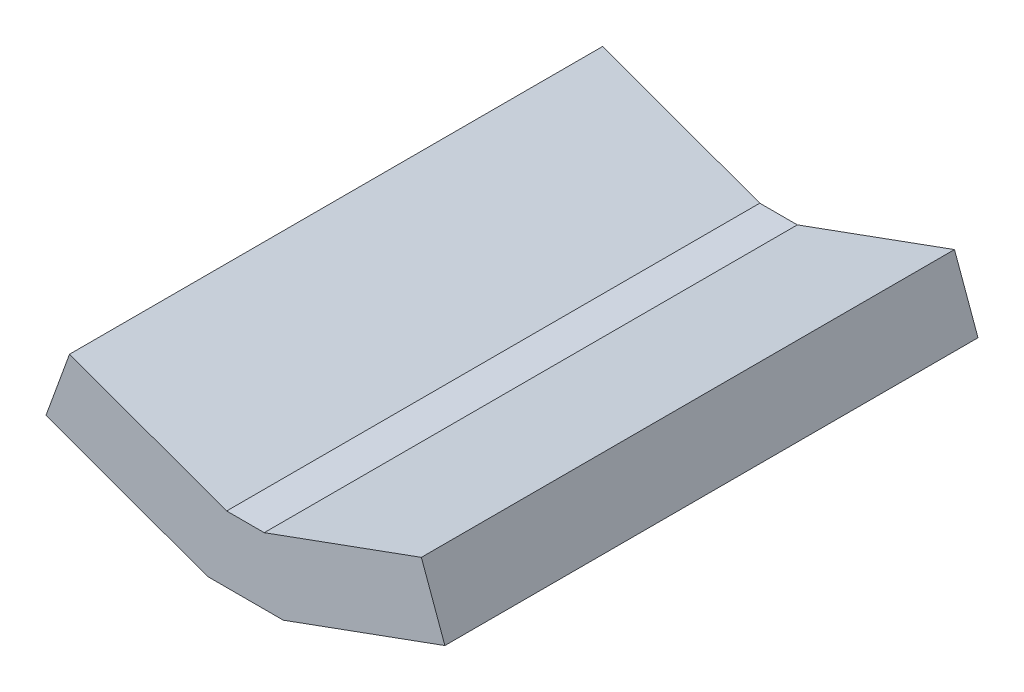
ISO-10303-21;
HEADER;
FILE_DESCRIPTION(('STEP AP214'),'2;1');
FILE_NAME('part.step','',(''),(''),'','','');
FILE_SCHEMA(('AUTOMOTIVE_DESIGN { 1 0 10303 214 1 1 1 1 }'));
ENDSEC;
DATA;
#1=APPLICATION_CONTEXT('core data for automotive mechanical design processes');
#2=APPLICATION_PROTOCOL_DEFINITION('international standard','automotive_design',2000,#1);
#3=PRODUCT_CONTEXT('',#1,'mechanical');
#4=PRODUCT('Part','Part','',(#3));
#5=PRODUCT_RELATED_PRODUCT_CATEGORY('part','',(#4));
#6=PRODUCT_DEFINITION_FORMATION('','',#4);
#7=PRODUCT_DEFINITION_CONTEXT('part definition',#1,'design');
#8=PRODUCT_DEFINITION('design','',#6,#7);
#9=PRODUCT_DEFINITION_SHAPE('','',#8);
#10=(LENGTH_UNIT() NAMED_UNIT(*) SI_UNIT(.MILLI.,.METRE.));
#11=(NAMED_UNIT(*) PLANE_ANGLE_UNIT() SI_UNIT($,.RADIAN.));
#12=(NAMED_UNIT(*) SI_UNIT($,.STERADIAN.) SOLID_ANGLE_UNIT());
#13=UNCERTAINTY_MEASURE_WITH_UNIT(LENGTH_MEASURE(1.E-05),#10,'distance_accuracy_value','');
#14=(GEOMETRIC_REPRESENTATION_CONTEXT(3) GLOBAL_UNCERTAINTY_ASSIGNED_CONTEXT((#13)) GLOBAL_UNIT_ASSIGNED_CONTEXT((#10,
#11,#12)) REPRESENTATION_CONTEXT('',''));
#15=CARTESIAN_POINT('',(0.,0.,0.));
#16=DIRECTION('',(0.,0.,1.));
#17=DIRECTION('',(1.,0.,0.));
#18=AXIS2_PLACEMENT_3D('',#15,#16,#17);
#19=CARTESIAN_POINT('',(11.,0.,77.4999999977638));
#20=DIRECTION('',(-0.34202014332567,0.939692620785908,0.));
#21=DIRECTION('',(-0.939692620785908,-0.34202014332567,0.));
#22=AXIS2_PLACEMENT_3D('',#19,#20,#21);
#23=PLANE('',#22);
#24=DIRECTION('',(0.,0.,-1.));
#25=VECTOR('',#24,1.);
#26=CARTESIAN_POINT('',(11.,0.,77.4999999977638));
#27=LINE('',#26,#25);
#28=CARTESIAN_POINT('',(11.,0.,77.4999999977638));
#29=VERTEX_POINT('',#28);
#30=CARTESIAN_POINT('',(11.,0.,-77.5));
#31=VERTEX_POINT('',#30);
#32=EDGE_CURVE('E117',#29,#31,#27,.T.);
#33=ORIENTED_EDGE('',*,*,#32,.T.);
#34=DIRECTION('',(0.939692620785908,0.34202014332567,0.));
#35=VECTOR('',#34,1.);
#36=CARTESIAN_POINT('',(11.,0.,-77.5));
#37=LINE('',#36,#35);
#38=CARTESIAN_POINT('',(57.9846310392954,17.1010071662835,-77.5));
#39=VERTEX_POINT('',#38);
#40=EDGE_CURVE('E111',#31,#39,#37,.T.);
#41=ORIENTED_EDGE('',*,*,#40,.T.);
#42=DIRECTION('',(0.,0.,-1.));
#43=VECTOR('',#42,1.);
#44=CARTESIAN_POINT('',(57.9846310392954,17.1010071662835,77.4999999977638));
#45=LINE('',#44,#43);
#46=CARTESIAN_POINT('',(57.9846310392954,17.1010071662835,77.4999999977638));
#47=VERTEX_POINT('',#46);
#48=EDGE_CURVE('E11',#47,#39,#45,.T.);
#49=ORIENTED_EDGE('',*,*,#48,.F.);
#50=DIRECTION('',(0.939692620785908,0.34202014332567,0.));
#51=VECTOR('',#50,1.);
#52=CARTESIAN_POINT('',(11.,0.,77.4999999977638));
#53=LINE('',#52,#51);
#54=EDGE_CURVE('E135',#29,#47,#53,.T.);
#55=ORIENTED_EDGE('',*,*,#54,.F.);
#56=EDGE_LOOP('',(#33,#41,#49,#55));
#57=FACE_BOUND('',#56,.T.);
#58=ADVANCED_FACE('F35',(#57),#23,.F.);
#59=CARTESIAN_POINT('',(57.9846310392954,17.1010071662835,77.4999999977638));
#60=DIRECTION('',(-0.939692620785908,-0.34202014332567,0.));
#61=DIRECTION('',(0.34202014332567,-0.939692620785908,0.));
#62=AXIS2_PLACEMENT_3D('',#59,#60,#61);
#63=PLANE('',#62);
#64=ORIENTED_EDGE('',*,*,#48,.T.);
#65=DIRECTION('',(-0.34202014332567,0.939692620785908,0.));
#66=VECTOR('',#65,1.);
#67=CARTESIAN_POINT('',(57.9846310392954,17.1010071662835,-77.5));
#68=LINE('',#67,#66);
#69=CARTESIAN_POINT('',(51.144228172782,35.8948595820016,-77.5));
#70=VERTEX_POINT('',#69);
#71=EDGE_CURVE('E101',#39,#70,#68,.T.);
#72=ORIENTED_EDGE('',*,*,#71,.T.);
#73=DIRECTION('',(0.,0.,-1.));
#74=VECTOR('',#73,1.);
#75=CARTESIAN_POINT('',(51.144228172782,35.8948595820016,77.4999999977638));
#76=LINE('',#75,#74);
#77=CARTESIAN_POINT('',(51.144228172782,35.8948595820016,77.4999999977638));
#78=VERTEX_POINT('',#77);
#79=EDGE_CURVE('E42',#78,#70,#76,.T.);
#80=ORIENTED_EDGE('',*,*,#79,.F.);
#81=DIRECTION('',(-0.34202014332567,0.939692620785908,0.));
#82=VECTOR('',#81,1.);
#83=CARTESIAN_POINT('',(57.9846310392954,17.1010071662835,77.4999999977638));
#84=LINE('',#83,#82);
#85=EDGE_CURVE('E102',#47,#78,#84,.T.);
#86=ORIENTED_EDGE('',*,*,#85,.F.);
#87=EDGE_LOOP('',(#64,#72,#80,#86));
#88=FACE_BOUND('',#87,.T.);
#89=ADVANCED_FACE('F99',(#88),#63,.F.);
#90=CARTESIAN_POINT('',(51.144228172782,35.8948595820016,77.4999999977638));
#91=DIRECTION('',(0.34202014332567,-0.939692620785908,0.));
#92=DIRECTION('',(0.939692620785908,0.34202014332567,0.));
#93=AXIS2_PLACEMENT_3D('',#90,#91,#92);
#94=PLANE('',#93);
#95=ORIENTED_EDGE('',*,*,#79,.T.);
#96=DIRECTION('',(-0.939692620785908,-0.34202014332567,0.));
#97=VECTOR('',#96,1.);
#98=CARTESIAN_POINT('',(51.144228172782,35.8948595820016,-77.5));
#99=LINE('',#98,#97);
#100=CARTESIAN_POINT('',(5.46220616816756,19.2679633312282,-77.5));
#101=VERTEX_POINT('',#100);
#102=EDGE_CURVE('E115',#70,#101,#99,.T.);
#103=ORIENTED_EDGE('',*,*,#102,.T.);
#104=DIRECTION('',(0.,0.,-1.));
#105=VECTOR('',#104,1.);
#106=CARTESIAN_POINT('',(5.46220616816756,19.2679633312282,77.4999999977638));
#107=LINE('',#106,#105);
#108=CARTESIAN_POINT('',(5.46220616816756,19.2679633312282,77.4999999977638));
#109=VERTEX_POINT('',#108);
#110=EDGE_CURVE('E157',#109,#101,#107,.T.);
#111=ORIENTED_EDGE('',*,*,#110,.F.);
#112=DIRECTION('',(-0.939692620785908,-0.34202014332567,0.));
#113=VECTOR('',#112,1.);
#114=CARTESIAN_POINT('',(51.144228172782,35.8948595820016,77.4999999977638));
#115=LINE('',#114,#113);
#116=EDGE_CURVE('E138',#78,#109,#115,.T.);
#117=ORIENTED_EDGE('',*,*,#116,.F.);
#118=EDGE_LOOP('',(#95,#103,#111,#117));
#119=FACE_BOUND('',#118,.T.);
#120=ADVANCED_FACE('F160',(#119),#94,.F.);
#121=CARTESIAN_POINT('',(5.46220616816756,19.2679633312282,77.4999999977638));
#122=DIRECTION('',(0.,-1.,0.));
#123=DIRECTION('',(0.,0.,-1.));
#124=AXIS2_PLACEMENT_3D('',#121,#122,#123);
#125=PLANE('',#124);
#126=ORIENTED_EDGE('',*,*,#110,.T.);
#127=DIRECTION('',(-1.,0.,0.));
#128=VECTOR('',#127,1.);
#129=CARTESIAN_POINT('',(5.46220616816756,19.2679633312282,-77.5));
#130=LINE('',#129,#128);
#131=CARTESIAN_POINT('',(-5.46220616816756,19.2679633312282,-77.5));
#132=VERTEX_POINT('',#131);
#133=EDGE_CURVE('E121',#101,#132,#130,.T.);
#134=ORIENTED_EDGE('',*,*,#133,.T.);
#135=DIRECTION('',(0.,0.,-1.));
#136=VECTOR('',#135,1.);
#137=CARTESIAN_POINT('',(-5.46220616816756,19.2679633312282,77.4999999977638));
#138=LINE('',#137,#136);
#139=CARTESIAN_POINT('',(-5.46220616816756,19.2679633312282,77.4999999977638));
#140=VERTEX_POINT('',#139);
#141=EDGE_CURVE('E155',#140,#132,#138,.T.);
#142=ORIENTED_EDGE('',*,*,#141,.F.);
#143=DIRECTION('',(-1.,0.,0.));
#144=VECTOR('',#143,1.);
#145=CARTESIAN_POINT('',(5.46220616816756,19.2679633312282,77.4999999977638));
#146=LINE('',#145,#144);
#147=EDGE_CURVE('E140',#109,#140,#146,.T.);
#148=ORIENTED_EDGE('',*,*,#147,.F.);
#149=EDGE_LOOP('',(#126,#134,#142,#148));
#150=FACE_BOUND('',#149,.T.);
#151=ADVANCED_FACE('F168',(#150),#125,.F.);
#152=CARTESIAN_POINT('',(-51.144228172782,35.8948595820016,77.4999999977638));
#153=DIRECTION('',(-0.34202014332567,-0.939692620785908,0.));
#154=DIRECTION('',(0.939692620785908,-0.34202014332567,0.));
#155=AXIS2_PLACEMENT_3D('',#152,#153,#154);
#156=PLANE('',#155);
#157=ORIENTED_EDGE('',*,*,#141,.T.);
#158=DIRECTION('',(-0.939692620785908,0.34202014332567,0.));
#159=VECTOR('',#158,1.);
#160=CARTESIAN_POINT('',(-51.144228172782,35.8948595820016,-77.5));
#161=LINE('',#160,#159);
#162=CARTESIAN_POINT('',(-51.144228172782,35.8948595820016,-77.5));
#163=VERTEX_POINT('',#162);
#164=EDGE_CURVE('E124',#132,#163,#161,.T.);
#165=ORIENTED_EDGE('',*,*,#164,.T.);
#166=DIRECTION('',(0.,0.,-1.));
#167=VECTOR('',#166,1.);
#168=CARTESIAN_POINT('',(-51.144228172782,35.8948595820016,77.4999999977638));
#169=LINE('',#168,#167);
#170=CARTESIAN_POINT('',(-51.144228172782,35.8948595820016,77.4999999977638));
#171=VERTEX_POINT('',#170);
#172=EDGE_CURVE('E153',#171,#163,#169,.T.);
#173=ORIENTED_EDGE('',*,*,#172,.F.);
#174=DIRECTION('',(-0.939692620785908,0.34202014332567,0.));
#175=VECTOR('',#174,1.);
#176=CARTESIAN_POINT('',(-51.144228172782,35.8948595820016,77.4999999977638));
#177=LINE('',#176,#175);
#178=EDGE_CURVE('E142',#140,#171,#177,.T.);
#179=ORIENTED_EDGE('',*,*,#178,.F.);
#180=EDGE_LOOP('',(#157,#165,#173,#179));
#181=FACE_BOUND('',#180,.T.);
#182=ADVANCED_FACE('F171',(#181),#156,.F.);
#183=CARTESIAN_POINT('',(-57.9846310392954,17.1010071662835,77.4999999977638));
#184=DIRECTION('',(0.939692620785908,-0.34202014332567,0.));
#185=DIRECTION('',(0.34202014332567,0.939692620785908,0.));
#186=AXIS2_PLACEMENT_3D('',#183,#184,#185);
#187=PLANE('',#186);
#188=ORIENTED_EDGE('',*,*,#172,.T.);
#189=DIRECTION('',(-0.34202014332567,-0.939692620785908,0.));
#190=VECTOR('',#189,1.);
#191=CARTESIAN_POINT('',(-57.9846310392954,17.1010071662835,-77.5));
#192=LINE('',#191,#190);
#193=CARTESIAN_POINT('',(-57.9846310392954,17.1010071662835,-77.5));
#194=VERTEX_POINT('',#193);
#195=EDGE_CURVE('E127',#163,#194,#192,.T.);
#196=ORIENTED_EDGE('',*,*,#195,.T.);
#197=DIRECTION('',(0.,0.,-1.));
#198=VECTOR('',#197,1.);
#199=CARTESIAN_POINT('',(-57.9846310392954,17.1010071662835,77.4999999977638));
#200=LINE('',#199,#198);
#201=CARTESIAN_POINT('',(-57.9846310392954,17.1010071662835,77.4999999977638));
#202=VERTEX_POINT('',#201);
#203=EDGE_CURVE('E151',#202,#194,#200,.T.);
#204=ORIENTED_EDGE('',*,*,#203,.F.);
#205=DIRECTION('',(-0.34202014332567,-0.939692620785908,0.));
#206=VECTOR('',#205,1.);
#207=CARTESIAN_POINT('',(-57.9846310392954,17.1010071662835,77.4999999977638));
#208=LINE('',#207,#206);
#209=EDGE_CURVE('E144',#171,#202,#208,.T.);
#210=ORIENTED_EDGE('',*,*,#209,.F.);
#211=EDGE_LOOP('',(#188,#196,#204,#210));
#212=FACE_BOUND('',#211,.T.);
#213=ADVANCED_FACE('F176',(#212),#187,.F.);
#214=CARTESIAN_POINT('',(-11.,0.,77.4999999977638));
#215=DIRECTION('',(0.34202014332567,0.939692620785908,0.));
#216=DIRECTION('',(-0.939692620785908,0.34202014332567,0.));
#217=AXIS2_PLACEMENT_3D('',#214,#215,#216);
#218=PLANE('',#217);
#219=ORIENTED_EDGE('',*,*,#203,.T.);
#220=DIRECTION('',(0.939692620785908,-0.34202014332567,0.));
#221=VECTOR('',#220,1.);
#222=CARTESIAN_POINT('',(-11.,0.,-77.5));
#223=LINE('',#222,#221);
#224=CARTESIAN_POINT('',(-11.,0.,-77.5));
#225=VERTEX_POINT('',#224);
#226=EDGE_CURVE('E130',#194,#225,#223,.T.);
#227=ORIENTED_EDGE('',*,*,#226,.T.);
#228=DIRECTION('',(0.,0.,-1.));
#229=VECTOR('',#228,1.);
#230=CARTESIAN_POINT('',(-11.,0.,77.4999999977638));
#231=LINE('',#230,#229);
#232=CARTESIAN_POINT('',(-11.,0.,77.4999999977638));
#233=VERTEX_POINT('',#232);
#234=EDGE_CURVE('E149',#233,#225,#231,.T.);
#235=ORIENTED_EDGE('',*,*,#234,.F.);
#236=DIRECTION('',(0.939692620785908,-0.34202014332567,0.));
#237=VECTOR('',#236,1.);
#238=CARTESIAN_POINT('',(-11.,0.,77.4999999977638));
#239=LINE('',#238,#237);
#240=EDGE_CURVE('E54',#202,#233,#239,.T.);
#241=ORIENTED_EDGE('',*,*,#240,.F.);
#242=EDGE_LOOP('',(#219,#227,#235,#241));
#243=FACE_BOUND('',#242,.T.);
#244=ADVANCED_FACE('F179',(#243),#218,.F.);
#245=CARTESIAN_POINT('',(-11.,0.,77.4999999977638));
#246=DIRECTION('',(0.,1.,0.));
#247=DIRECTION('',(0.,0.,1.));
#248=AXIS2_PLACEMENT_3D('',#245,#246,#247);
#249=PLANE('',#248);
#250=ORIENTED_EDGE('',*,*,#234,.T.);
#251=DIRECTION('',(1.,0.,0.));
#252=VECTOR('',#251,1.);
#253=CARTESIAN_POINT('',(-11.,0.,-77.5));
#254=LINE('',#253,#252);
#255=EDGE_CURVE('E133',#225,#31,#254,.T.);
#256=ORIENTED_EDGE('',*,*,#255,.T.);
#257=ORIENTED_EDGE('',*,*,#32,.F.);
#258=DIRECTION('',(1.,0.,0.));
#259=VECTOR('',#258,1.);
#260=CARTESIAN_POINT('',(-11.,0.,77.4999999977638));
#261=LINE('',#260,#259);
#262=EDGE_CURVE('E49',#233,#29,#261,.T.);
#263=ORIENTED_EDGE('',*,*,#262,.F.);
#264=EDGE_LOOP('',(#250,#256,#257,#263));
#265=FACE_BOUND('',#264,.T.);
#266=ADVANCED_FACE('F181',(#265),#249,.F.);
#267=CARTESIAN_POINT('',(0.,0.,77.4999999977638));
#268=DIRECTION('',(0.,0.,1.));
#269=DIRECTION('',(1.,0.,0.));
#270=AXIS2_PLACEMENT_3D('',#267,#268,#269);
#271=PLANE('',#270);
#272=ORIENTED_EDGE('',*,*,#54,.T.);
#273=ORIENTED_EDGE('',*,*,#85,.T.);
#274=ORIENTED_EDGE('',*,*,#116,.T.);
#275=ORIENTED_EDGE('',*,*,#147,.T.);
#276=ORIENTED_EDGE('',*,*,#178,.T.);
#277=ORIENTED_EDGE('',*,*,#209,.T.);
#278=ORIENTED_EDGE('',*,*,#240,.T.);
#279=ORIENTED_EDGE('',*,*,#262,.T.);
#280=EDGE_LOOP('',(#272,#273,#274,#275,#276,#277,#278,#279));
#281=FACE_BOUND('',#280,.T.);
#282=ADVANCED_FACE('F163',(#281),#271,.T.);
#283=CARTESIAN_POINT('',(0.,0.,-77.5));
#284=DIRECTION('',(0.,0.,1.));
#285=DIRECTION('',(1.,0.,0.));
#286=AXIS2_PLACEMENT_3D('',#283,#284,#285);
#287=PLANE('',#286);
#288=ORIENTED_EDGE('',*,*,#40,.F.);
#289=ORIENTED_EDGE('',*,*,#255,.F.);
#290=ORIENTED_EDGE('',*,*,#226,.F.);
#291=ORIENTED_EDGE('',*,*,#195,.F.);
#292=ORIENTED_EDGE('',*,*,#164,.F.);
#293=ORIENTED_EDGE('',*,*,#133,.F.);
#294=ORIENTED_EDGE('',*,*,#102,.F.);
#295=ORIENTED_EDGE('',*,*,#71,.F.);
#296=EDGE_LOOP('',(#288,#289,#290,#291,#292,#293,#294,#295));
#297=FACE_BOUND('',#296,.T.);
#298=ADVANCED_FACE('F109',(#297),#287,.F.);
#299=CLOSED_SHELL('',(#58,#89,#120,#151,#182,#213,#244,#266,#282,#298));
#300=MANIFOLD_SOLID_BREP('B2',#299);
#301=ADVANCED_BREP_SHAPE_REPRESENTATION('',(#18,#300),#14);
#302=SHAPE_DEFINITION_REPRESENTATION(#9,#301);
ENDSEC;
END-ISO-10303-21;
